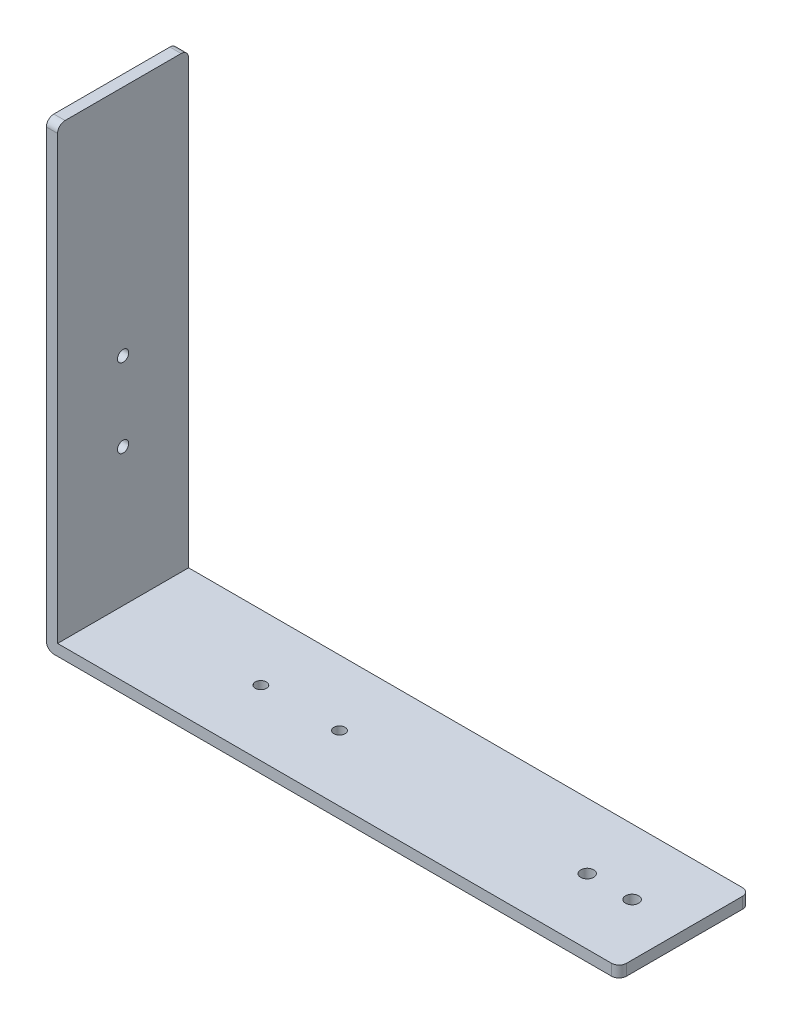
ISO-10303-21;
HEADER;
FILE_DESCRIPTION(('STEP AP214'),'2;1');
FILE_NAME('part.step','',(''),(''),'','','');
FILE_SCHEMA(('AUTOMOTIVE_DESIGN { 1 0 10303 214 1 1 1 1 }'));
ENDSEC;
DATA;
#1=APPLICATION_CONTEXT('core data for automotive mechanical design processes');
#2=APPLICATION_PROTOCOL_DEFINITION('international standard','automotive_design',2000,#1);
#3=PRODUCT_CONTEXT('',#1,'mechanical');
#4=PRODUCT('Part','Part','',(#3));
#5=PRODUCT_RELATED_PRODUCT_CATEGORY('part','',(#4));
#6=PRODUCT_DEFINITION_FORMATION('','',#4);
#7=PRODUCT_DEFINITION_CONTEXT('part definition',#1,'design');
#8=PRODUCT_DEFINITION('design','',#6,#7);
#9=PRODUCT_DEFINITION_SHAPE('','',#8);
#10=(LENGTH_UNIT() NAMED_UNIT(*) SI_UNIT(.MILLI.,.METRE.));
#11=(NAMED_UNIT(*) PLANE_ANGLE_UNIT() SI_UNIT($,.RADIAN.));
#12=(NAMED_UNIT(*) SI_UNIT($,.STERADIAN.) SOLID_ANGLE_UNIT());
#13=UNCERTAINTY_MEASURE_WITH_UNIT(LENGTH_MEASURE(1.E-05),#10,'distance_accuracy_value','');
#14=(GEOMETRIC_REPRESENTATION_CONTEXT(3) GLOBAL_UNCERTAINTY_ASSIGNED_CONTEXT((#13)) GLOBAL_UNIT_ASSIGNED_CONTEXT((#10,
#11,#12)) REPRESENTATION_CONTEXT('',''));
#15=CARTESIAN_POINT('',(0.,0.,0.));
#16=DIRECTION('',(0.,0.,1.));
#17=DIRECTION('',(1.,0.,0.));
#18=AXIS2_PLACEMENT_3D('',#15,#16,#17);
#19=CARTESIAN_POINT('',(0.,-3.,35.));
#20=DIRECTION('',(0.,1.,0.));
#21=DIRECTION('',(0.,0.,1.));
#22=AXIS2_PLACEMENT_3D('',#19,#20,#21);
#23=PLANE('',#22);
#24=CARTESIAN_POINT('',(57.8,-3.,17.5));
#25=DIRECTION('',(0.,1.,0.));
#26=DIRECTION('',(0.,0.,1.));
#27=AXIS2_PLACEMENT_3D('',#24,#25,#26);
#28=CIRCLE('',#27,1.5);
#29=CARTESIAN_POINT('',(57.8,-3.,19.));
#30=VERTEX_POINT('',#29);
#31=EDGE_CURVE('E212',#30,#30,#28,.T.);
#32=ORIENTED_EDGE('',*,*,#31,.T.);
#33=EDGE_LOOP('',(#32));
#34=FACE_BOUND('',#33,.T.);
#35=CARTESIAN_POINT('',(36.8,-3.,17.5));
#36=DIRECTION('',(0.,1.,0.));
#37=DIRECTION('',(0.,0.,1.));
#38=AXIS2_PLACEMENT_3D('',#35,#36,#37);
#39=CIRCLE('',#38,1.5);
#40=CARTESIAN_POINT('',(36.8,-3.,19.));
#41=VERTEX_POINT('',#40);
#42=EDGE_CURVE('E227',#41,#41,#39,.T.);
#43=ORIENTED_EDGE('',*,*,#42,.T.);
#44=EDGE_LOOP('',(#43));
#45=FACE_BOUND('',#44,.T.);
#46=CARTESIAN_POINT('',(136.,-3.,17.5));
#47=DIRECTION('',(0.,1.,0.));
#48=DIRECTION('',(0.,0.,1.));
#49=AXIS2_PLACEMENT_3D('',#46,#47,#48);
#50=CIRCLE('',#49,1.75000000000001);
#51=CARTESIAN_POINT('',(136.,-3.,19.25));
#52=VERTEX_POINT('',#51);
#53=EDGE_CURVE('E233',#52,#52,#50,.T.);
#54=ORIENTED_EDGE('',*,*,#53,.T.);
#55=EDGE_LOOP('',(#54));
#56=FACE_BOUND('',#55,.T.);
#57=CARTESIAN_POINT('',(124.,-3.,17.5));
#58=DIRECTION('',(0.,1.,0.));
#59=DIRECTION('',(0.,0.,1.));
#60=AXIS2_PLACEMENT_3D('',#57,#58,#59);
#61=CIRCLE('',#60,1.75000000000001);
#62=CARTESIAN_POINT('',(124.,-3.,19.25));
#63=VERTEX_POINT('',#62);
#64=EDGE_CURVE('E154',#63,#63,#61,.T.);
#65=ORIENTED_EDGE('',*,*,#64,.T.);
#66=EDGE_LOOP('',(#65));
#67=FACE_BOUND('',#66,.T.);
#68=DIRECTION('',(1.,0.,0.));
#69=VECTOR('',#68,1.);
#70=CARTESIAN_POINT('',(0.,-3.,35.));
#71=LINE('',#70,#69);
#72=CARTESIAN_POINT('',(-1.,-3.,35.));
#73=VERTEX_POINT('',#72);
#74=CARTESIAN_POINT('',(148.,-3.,35.));
#75=VERTEX_POINT('',#74);
#76=EDGE_CURVE('E143',#73,#75,#71,.T.);
#77=ORIENTED_EDGE('',*,*,#76,.F.);
#78=DIRECTION('',(0.,0.,-1.));
#79=VECTOR('',#78,1.);
#80=CARTESIAN_POINT('',(-1.,-3.,35.));
#81=LINE('',#80,#79);
#82=CARTESIAN_POINT('',(-1.,-3.,0.));
#83=VERTEX_POINT('',#82);
#84=EDGE_CURVE('E171',#73,#83,#81,.T.);
#85=ORIENTED_EDGE('',*,*,#84,.T.);
#86=DIRECTION('',(1.,0.,0.));
#87=VECTOR('',#86,1.);
#88=CARTESIAN_POINT('',(0.,-3.,0.));
#89=LINE('',#88,#87);
#90=CARTESIAN_POINT('',(148.,-3.,0.));
#91=VERTEX_POINT('',#90);
#92=EDGE_CURVE('E151',#83,#91,#89,.T.);
#93=ORIENTED_EDGE('',*,*,#92,.T.);
#94=CARTESIAN_POINT('',(148.,-3.,2.));
#95=DIRECTION('',(0.,1.,0.));
#96=DIRECTION('',(0.,0.,1.));
#97=AXIS2_PLACEMENT_3D('',#94,#95,#96);
#98=CIRCLE('',#97,2.);
#99=CARTESIAN_POINT('',(150.,-3.,2.));
#100=VERTEX_POINT('',#99);
#101=EDGE_CURVE('E167',#91,#100,#98,.F.);
#102=ORIENTED_EDGE('',*,*,#101,.T.);
#103=DIRECTION('',(0.,0.,-1.));
#104=VECTOR('',#103,1.);
#105=CARTESIAN_POINT('',(150.,-3.,35.));
#106=LINE('',#105,#104);
#107=CARTESIAN_POINT('',(150.,-3.,33.));
#108=VERTEX_POINT('',#107);
#109=EDGE_CURVE('E165',#108,#100,#106,.T.);
#110=ORIENTED_EDGE('',*,*,#109,.F.);
#111=CARTESIAN_POINT('',(148.,-3.,33.));
#112=DIRECTION('',(0.,1.,0.));
#113=DIRECTION('',(0.,0.,1.));
#114=AXIS2_PLACEMENT_3D('',#111,#112,#113);
#115=CIRCLE('',#114,2.);
#116=EDGE_CURVE('E169',#108,#75,#115,.F.);
#117=ORIENTED_EDGE('',*,*,#116,.T.);
#118=EDGE_LOOP('',(#77,#85,#93,#102,#110,#117));
#119=FACE_BOUND('',#118,.T.);
#120=ADVANCED_FACE('F33',(#34,#45,#56,#67,#119),#23,.F.);
#121=CARTESIAN_POINT('',(150.,0.,35.));
#122=DIRECTION('',(1.,0.,0.));
#123=DIRECTION('',(0.,0.,-1.));
#124=AXIS2_PLACEMENT_3D('',#121,#122,#123);
#125=PLANE('',#124);
#126=DIRECTION('',(0.,0.,-1.));
#127=VECTOR('',#126,1.);
#128=CARTESIAN_POINT('',(150.,0.,35.));
#129=LINE('',#128,#127);
#130=CARTESIAN_POINT('',(150.,0.,33.));
#131=VERTEX_POINT('',#130);
#132=CARTESIAN_POINT('',(150.,0.,2.));
#133=VERTEX_POINT('',#132);
#134=EDGE_CURVE('E135',#131,#133,#129,.T.);
#135=ORIENTED_EDGE('',*,*,#134,.F.);
#136=DIRECTION('',(0.,-1.,0.));
#137=VECTOR('',#136,1.);
#138=CARTESIAN_POINT('',(150.,-3.,33.));
#139=LINE('',#138,#137);
#140=EDGE_CURVE('E202',#131,#108,#139,.T.);
#141=ORIENTED_EDGE('',*,*,#140,.T.);
#142=ORIENTED_EDGE('',*,*,#109,.T.);
#143=DIRECTION('',(0.,-1.,0.));
#144=VECTOR('',#143,1.);
#145=CARTESIAN_POINT('',(150.,0.,2.));
#146=LINE('',#145,#144);
#147=EDGE_CURVE('E50',#100,#133,#146,.F.);
#148=ORIENTED_EDGE('',*,*,#147,.T.);
#149=EDGE_LOOP('',(#135,#141,#142,#148));
#150=FACE_BOUND('',#149,.T.);
#151=ADVANCED_FACE('F260',(#150),#125,.T.);
#152=CARTESIAN_POINT('',(0.,0.,35.));
#153=DIRECTION('',(0.,1.,0.));
#154=DIRECTION('',(0.,0.,1.));
#155=AXIS2_PLACEMENT_3D('',#152,#153,#154);
#156=PLANE('',#155);
#157=CARTESIAN_POINT('',(57.8,0.,17.5));
#158=DIRECTION('',(0.,1.,0.));
#159=DIRECTION('',(0.,0.,1.));
#160=AXIS2_PLACEMENT_3D('',#157,#158,#159);
#161=CIRCLE('',#160,1.5);
#162=CARTESIAN_POINT('',(57.8,0.,19.));
#163=VERTEX_POINT('',#162);
#164=EDGE_CURVE('E207',#163,#163,#161,.T.);
#165=ORIENTED_EDGE('',*,*,#164,.F.);
#166=EDGE_LOOP('',(#165));
#167=FACE_BOUND('',#166,.T.);
#168=CARTESIAN_POINT('',(36.8,0.,17.5));
#169=DIRECTION('',(0.,1.,0.));
#170=DIRECTION('',(0.,0.,1.));
#171=AXIS2_PLACEMENT_3D('',#168,#169,#170);
#172=CIRCLE('',#171,1.5);
#173=CARTESIAN_POINT('',(36.8,0.,19.));
#174=VERTEX_POINT('',#173);
#175=EDGE_CURVE('E224',#174,#174,#172,.T.);
#176=ORIENTED_EDGE('',*,*,#175,.F.);
#177=EDGE_LOOP('',(#176));
#178=FACE_BOUND('',#177,.T.);
#179=CARTESIAN_POINT('',(136.,0.,17.5));
#180=DIRECTION('',(0.,1.,0.));
#181=DIRECTION('',(0.,0.,1.));
#182=AXIS2_PLACEMENT_3D('',#179,#180,#181);
#183=CIRCLE('',#182,1.75000000000001);
#184=CARTESIAN_POINT('',(136.,0.,19.25));
#185=VERTEX_POINT('',#184);
#186=EDGE_CURVE('E230',#185,#185,#183,.T.);
#187=ORIENTED_EDGE('',*,*,#186,.F.);
#188=EDGE_LOOP('',(#187));
#189=FACE_BOUND('',#188,.T.);
#190=CARTESIAN_POINT('',(124.,0.,17.5));
#191=DIRECTION('',(0.,1.,0.));
#192=DIRECTION('',(0.,0.,1.));
#193=AXIS2_PLACEMENT_3D('',#190,#191,#192);
#194=CIRCLE('',#193,1.75000000000001);
#195=CARTESIAN_POINT('',(124.,0.,19.25));
#196=VERTEX_POINT('',#195);
#197=EDGE_CURVE('E236',#196,#196,#194,.T.);
#198=ORIENTED_EDGE('',*,*,#197,.F.);
#199=EDGE_LOOP('',(#198));
#200=FACE_BOUND('',#199,.T.);
#201=DIRECTION('',(1.,0.,0.));
#202=VECTOR('',#201,1.);
#203=CARTESIAN_POINT('',(0.,0.,35.));
#204=LINE('',#203,#202);
#205=CARTESIAN_POINT('',(0.,0.,35.));
#206=VERTEX_POINT('',#205);
#207=CARTESIAN_POINT('',(148.,0.,35.));
#208=VERTEX_POINT('',#207);
#209=EDGE_CURVE('E130',#206,#208,#204,.T.);
#210=ORIENTED_EDGE('',*,*,#209,.T.);
#211=CARTESIAN_POINT('',(148.,0.,33.));
#212=DIRECTION('',(0.,1.,0.));
#213=DIRECTION('',(0.,0.,1.));
#214=AXIS2_PLACEMENT_3D('',#211,#212,#213);
#215=CIRCLE('',#214,2.);
#216=EDGE_CURVE('E11',#208,#131,#215,.T.);
#217=ORIENTED_EDGE('',*,*,#216,.T.);
#218=ORIENTED_EDGE('',*,*,#134,.T.);
#219=CARTESIAN_POINT('',(148.,0.,2.));
#220=DIRECTION('',(0.,1.,0.));
#221=DIRECTION('',(0.,0.,1.));
#222=AXIS2_PLACEMENT_3D('',#219,#220,#221);
#223=CIRCLE('',#222,2.);
#224=CARTESIAN_POINT('',(148.,0.,0.));
#225=VERTEX_POINT('',#224);
#226=EDGE_CURVE('E42',#133,#225,#223,.T.);
#227=ORIENTED_EDGE('',*,*,#226,.T.);
#228=DIRECTION('',(1.,0.,0.));
#229=VECTOR('',#228,1.);
#230=CARTESIAN_POINT('',(0.,0.,0.));
#231=LINE('',#230,#229);
#232=CARTESIAN_POINT('',(0.,0.,0.));
#233=VERTEX_POINT('',#232);
#234=EDGE_CURVE('E134',#233,#225,#231,.T.);
#235=ORIENTED_EDGE('',*,*,#234,.F.);
#236=DIRECTION('',(0.,0.,-1.));
#237=VECTOR('',#236,1.);
#238=CARTESIAN_POINT('',(0.,0.,35.));
#239=LINE('',#238,#237);
#240=EDGE_CURVE('E123',#206,#233,#239,.T.);
#241=ORIENTED_EDGE('',*,*,#240,.F.);
#242=EDGE_LOOP('',(#210,#217,#218,#227,#235,#241));
#243=FACE_BOUND('',#242,.T.);
#244=ADVANCED_FACE('F132',(#167,#178,#189,#200,#243),#156,.T.);
#245=CARTESIAN_POINT('',(0.,0.,35.));
#246=DIRECTION('',(1.,0.,0.));
#247=DIRECTION('',(0.,0.,-1.));
#248=AXIS2_PLACEMENT_3D('',#245,#246,#247);
#249=PLANE('',#248);
#250=CARTESIAN_POINT('',(0.,57.8,17.5));
#251=DIRECTION('',(1.,0.,0.));
#252=DIRECTION('',(0.,0.,-1.));
#253=AXIS2_PLACEMENT_3D('',#250,#251,#252);
#254=CIRCLE('',#253,1.5);
#255=CARTESIAN_POINT('',(0.,57.8,16.));
#256=VERTEX_POINT('',#255);
#257=EDGE_CURVE('E219',#256,#256,#254,.T.);
#258=ORIENTED_EDGE('',*,*,#257,.F.);
#259=EDGE_LOOP('',(#258));
#260=FACE_BOUND('',#259,.T.);
#261=CARTESIAN_POINT('',(0.,36.8,17.5));
#262=DIRECTION('',(1.,0.,0.));
#263=DIRECTION('',(0.,0.,-1.));
#264=AXIS2_PLACEMENT_3D('',#261,#262,#263);
#265=CIRCLE('',#264,1.5);
#266=CARTESIAN_POINT('',(0.,36.8,16.));
#267=VERTEX_POINT('',#266);
#268=EDGE_CURVE('E208',#267,#267,#265,.T.);
#269=ORIENTED_EDGE('',*,*,#268,.F.);
#270=EDGE_LOOP('',(#269));
#271=FACE_BOUND('',#270,.T.);
#272=DIRECTION('',(0.,0.,-1.));
#273=VECTOR('',#272,1.);
#274=CARTESIAN_POINT('',(0.,120.,35.));
#275=LINE('',#274,#273);
#276=CARTESIAN_POINT('',(0.,120.,33.));
#277=VERTEX_POINT('',#276);
#278=CARTESIAN_POINT('',(0.,120.,2.));
#279=VERTEX_POINT('',#278);
#280=EDGE_CURVE('E136',#277,#279,#275,.T.);
#281=ORIENTED_EDGE('',*,*,#280,.F.);
#282=CARTESIAN_POINT('',(0.,118.,33.));
#283=DIRECTION('',(1.,0.,0.));
#284=DIRECTION('',(0.,0.,-1.));
#285=AXIS2_PLACEMENT_3D('',#282,#283,#284);
#286=CIRCLE('',#285,2.);
#287=CARTESIAN_POINT('',(0.,118.,35.));
#288=VERTEX_POINT('',#287);
#289=EDGE_CURVE('E125',#277,#288,#286,.T.);
#290=ORIENTED_EDGE('',*,*,#289,.T.);
#291=DIRECTION('',(0.,-1.,0.));
#292=VECTOR('',#291,1.);
#293=CARTESIAN_POINT('',(0.,0.,35.));
#294=LINE('',#293,#292);
#295=EDGE_CURVE('E118',#288,#206,#294,.T.);
#296=ORIENTED_EDGE('',*,*,#295,.T.);
#297=ORIENTED_EDGE('',*,*,#240,.T.);
#298=DIRECTION('',(0.,-1.,0.));
#299=VECTOR('',#298,1.);
#300=CARTESIAN_POINT('',(0.,0.,0.));
#301=LINE('',#300,#299);
#302=CARTESIAN_POINT('',(0.,118.,0.));
#303=VERTEX_POINT('',#302);
#304=EDGE_CURVE('E156',#303,#233,#301,.T.);
#305=ORIENTED_EDGE('',*,*,#304,.F.);
#306=CARTESIAN_POINT('',(0.,118.,2.));
#307=DIRECTION('',(1.,0.,0.));
#308=DIRECTION('',(0.,0.,-1.));
#309=AXIS2_PLACEMENT_3D('',#306,#307,#308);
#310=CIRCLE('',#309,2.);
#311=EDGE_CURVE('E198',#303,#279,#310,.T.);
#312=ORIENTED_EDGE('',*,*,#311,.T.);
#313=EDGE_LOOP('',(#281,#290,#296,#297,#305,#312));
#314=FACE_BOUND('',#313,.T.);
#315=ADVANCED_FACE('F121',(#260,#271,#314),#249,.T.);
#316=CARTESIAN_POINT('',(-3.,120.,35.));
#317=DIRECTION('',(0.,1.,0.));
#318=DIRECTION('',(0.,0.,1.));
#319=AXIS2_PLACEMENT_3D('',#316,#317,#318);
#320=PLANE('',#319);
#321=DIRECTION('',(0.,0.,-1.));
#322=VECTOR('',#321,1.);
#323=CARTESIAN_POINT('',(-3.,120.,35.));
#324=LINE('',#323,#322);
#325=CARTESIAN_POINT('',(-3.,120.,33.));
#326=VERTEX_POINT('',#325);
#327=CARTESIAN_POINT('',(-3.,120.,2.));
#328=VERTEX_POINT('',#327);
#329=EDGE_CURVE('E150',#326,#328,#324,.T.);
#330=ORIENTED_EDGE('',*,*,#329,.F.);
#331=DIRECTION('',(1.,0.,0.));
#332=VECTOR('',#331,1.);
#333=CARTESIAN_POINT('',(0.,120.,33.));
#334=LINE('',#333,#332);
#335=EDGE_CURVE('E195',#326,#277,#334,.T.);
#336=ORIENTED_EDGE('',*,*,#335,.T.);
#337=ORIENTED_EDGE('',*,*,#280,.T.);
#338=DIRECTION('',(1.,0.,0.));
#339=VECTOR('',#338,1.);
#340=CARTESIAN_POINT('',(-3.,120.,2.));
#341=LINE('',#340,#339);
#342=EDGE_CURVE('E193',#279,#328,#341,.F.);
#343=ORIENTED_EDGE('',*,*,#342,.T.);
#344=EDGE_LOOP('',(#330,#336,#337,#343));
#345=FACE_BOUND('',#344,.T.);
#346=ADVANCED_FACE('F299',(#345),#320,.T.);
#347=CARTESIAN_POINT('',(-3.,0.,35.));
#348=DIRECTION('',(1.,0.,0.));
#349=DIRECTION('',(0.,0.,-1.));
#350=AXIS2_PLACEMENT_3D('',#347,#348,#349);
#351=PLANE('',#350);
#352=CARTESIAN_POINT('',(-3.,57.8,17.5));
#353=DIRECTION('',(1.,0.,0.));
#354=DIRECTION('',(0.,0.,-1.));
#355=AXIS2_PLACEMENT_3D('',#352,#353,#354);
#356=CIRCLE('',#355,1.5);
#357=CARTESIAN_POINT('',(-3.,57.8,16.));
#358=VERTEX_POINT('',#357);
#359=EDGE_CURVE('E37',#358,#358,#356,.T.);
#360=ORIENTED_EDGE('',*,*,#359,.T.);
#361=EDGE_LOOP('',(#360));
#362=FACE_BOUND('',#361,.T.);
#363=CARTESIAN_POINT('',(-3.,36.8,17.5));
#364=DIRECTION('',(1.,0.,0.));
#365=DIRECTION('',(0.,0.,-1.));
#366=AXIS2_PLACEMENT_3D('',#363,#364,#365);
#367=CIRCLE('',#366,1.5);
#368=CARTESIAN_POINT('',(-3.,36.8,16.));
#369=VERTEX_POINT('',#368);
#370=EDGE_CURVE('E205',#369,#369,#367,.T.);
#371=ORIENTED_EDGE('',*,*,#370,.T.);
#372=EDGE_LOOP('',(#371));
#373=FACE_BOUND('',#372,.T.);
#374=DIRECTION('',(0.,1.,0.));
#375=VECTOR('',#374,1.);
#376=CARTESIAN_POINT('',(-3.,0.,0.));
#377=LINE('',#376,#375);
#378=CARTESIAN_POINT('',(-3.,118.,0.));
#379=VERTEX_POINT('',#378);
#380=CARTESIAN_POINT('',(-3.,-1.,0.));
#381=VERTEX_POINT('',#380);
#382=EDGE_CURVE('E145',#379,#381,#377,.F.);
#383=ORIENTED_EDGE('',*,*,#382,.T.);
#384=DIRECTION('',(0.,0.,-1.));
#385=VECTOR('',#384,1.);
#386=CARTESIAN_POINT('',(-3.,-1.,35.));
#387=LINE('',#386,#385);
#388=CARTESIAN_POINT('',(-3.,-1.,35.));
#389=VERTEX_POINT('',#388);
#390=EDGE_CURVE('E186',#381,#389,#387,.F.);
#391=ORIENTED_EDGE('',*,*,#390,.T.);
#392=DIRECTION('',(0.,1.,0.));
#393=VECTOR('',#392,1.);
#394=CARTESIAN_POINT('',(-3.,0.,35.));
#395=LINE('',#394,#393);
#396=CARTESIAN_POINT('',(-3.,118.,35.));
#397=VERTEX_POINT('',#396);
#398=EDGE_CURVE('E129',#397,#389,#395,.F.);
#399=ORIENTED_EDGE('',*,*,#398,.F.);
#400=CARTESIAN_POINT('',(-3.,118.,33.));
#401=DIRECTION('',(1.,0.,0.));
#402=DIRECTION('',(0.,0.,-1.));
#403=AXIS2_PLACEMENT_3D('',#400,#401,#402);
#404=CIRCLE('',#403,2.);
#405=EDGE_CURVE('E184',#397,#326,#404,.F.);
#406=ORIENTED_EDGE('',*,*,#405,.T.);
#407=ORIENTED_EDGE('',*,*,#329,.T.);
#408=CARTESIAN_POINT('',(-3.,118.,2.));
#409=DIRECTION('',(1.,0.,0.));
#410=DIRECTION('',(0.,0.,-1.));
#411=AXIS2_PLACEMENT_3D('',#408,#409,#410);
#412=CIRCLE('',#411,2.);
#413=EDGE_CURVE('E182',#328,#379,#412,.F.);
#414=ORIENTED_EDGE('',*,*,#413,.T.);
#415=EDGE_LOOP('',(#383,#391,#399,#406,#407,#414));
#416=FACE_BOUND('',#415,.T.);
#417=ADVANCED_FACE('F303',(#362,#373,#416),#351,.F.);
#418=CARTESIAN_POINT('',(0.,0.,35.));
#419=DIRECTION('',(0.,0.,-1.));
#420=DIRECTION('',(-1.,0.,0.));
#421=AXIS2_PLACEMENT_3D('',#418,#419,#420);
#422=PLANE('',#421);
#423=ORIENTED_EDGE('',*,*,#398,.T.);
#424=CARTESIAN_POINT('',(-1.,-1.,35.));
#425=DIRECTION('',(0.,0.,-1.));
#426=DIRECTION('',(-1.,0.,0.));
#427=AXIS2_PLACEMENT_3D('',#424,#425,#426);
#428=CIRCLE('',#427,2.);
#429=EDGE_CURVE('E191',#389,#73,#428,.F.);
#430=ORIENTED_EDGE('',*,*,#429,.T.);
#431=ORIENTED_EDGE('',*,*,#76,.T.);
#432=DIRECTION('',(0.,-1.,0.));
#433=VECTOR('',#432,1.);
#434=CARTESIAN_POINT('',(148.,0.,35.));
#435=LINE('',#434,#433);
#436=EDGE_CURVE('E142',#75,#208,#435,.F.);
#437=ORIENTED_EDGE('',*,*,#436,.T.);
#438=ORIENTED_EDGE('',*,*,#209,.F.);
#439=ORIENTED_EDGE('',*,*,#295,.F.);
#440=DIRECTION('',(1.,0.,0.));
#441=VECTOR('',#440,1.);
#442=CARTESIAN_POINT('',(-3.,118.,35.));
#443=LINE('',#442,#441);
#444=EDGE_CURVE('E189',#288,#397,#443,.F.);
#445=ORIENTED_EDGE('',*,*,#444,.T.);
#446=EDGE_LOOP('',(#423,#430,#431,#437,#438,#439,#445));
#447=FACE_BOUND('',#446,.T.);
#448=ADVANCED_FACE('F139',(#447),#422,.F.);
#449=CARTESIAN_POINT('',(0.,0.,0.));
#450=DIRECTION('',(0.,0.,-1.));
#451=DIRECTION('',(-1.,0.,0.));
#452=AXIS2_PLACEMENT_3D('',#449,#450,#451);
#453=PLANE('',#452);
#454=ORIENTED_EDGE('',*,*,#92,.F.);
#455=CARTESIAN_POINT('',(-1.,-1.,0.));
#456=DIRECTION('',(0.,0.,-1.));
#457=DIRECTION('',(-1.,0.,0.));
#458=AXIS2_PLACEMENT_3D('',#455,#456,#457);
#459=CIRCLE('',#458,2.);
#460=EDGE_CURVE('E180',#83,#381,#459,.T.);
#461=ORIENTED_EDGE('',*,*,#460,.T.);
#462=ORIENTED_EDGE('',*,*,#382,.F.);
#463=DIRECTION('',(1.,0.,0.));
#464=VECTOR('',#463,1.);
#465=CARTESIAN_POINT('',(0.,118.,0.));
#466=LINE('',#465,#464);
#467=EDGE_CURVE('E177',#379,#303,#466,.T.);
#468=ORIENTED_EDGE('',*,*,#467,.T.);
#469=ORIENTED_EDGE('',*,*,#304,.T.);
#470=ORIENTED_EDGE('',*,*,#234,.T.);
#471=DIRECTION('',(0.,-1.,0.));
#472=VECTOR('',#471,1.);
#473=CARTESIAN_POINT('',(148.,0.,0.));
#474=LINE('',#473,#472);
#475=EDGE_CURVE('E174',#225,#91,#474,.T.);
#476=ORIENTED_EDGE('',*,*,#475,.T.);
#477=EDGE_LOOP('',(#454,#461,#462,#468,#469,#470,#476));
#478=FACE_BOUND('',#477,.T.);
#479=ADVANCED_FACE('F246',(#478),#453,.T.);
#480=CARTESIAN_POINT('',(124.,-10.,17.5));
#481=DIRECTION('',(0.,1.,0.));
#482=DIRECTION('',(0.,0.,1.));
#483=AXIS2_PLACEMENT_3D('',#480,#481,#482);
#484=CYLINDRICAL_SURFACE('',#483,1.75000000000001);
#485=ORIENTED_EDGE('',*,*,#197,.T.);
#486=EDGE_LOOP('',(#485));
#487=FACE_BOUND('',#486,.T.);
#488=ORIENTED_EDGE('',*,*,#64,.F.);
#489=EDGE_LOOP('',(#488));
#490=FACE_BOUND('',#489,.T.);
#491=ADVANCED_FACE('F243',(#487,#490),#484,.F.);
#492=CARTESIAN_POINT('',(136.,-10.,17.5));
#493=DIRECTION('',(0.,1.,0.));
#494=DIRECTION('',(0.,0.,1.));
#495=AXIS2_PLACEMENT_3D('',#492,#493,#494);
#496=CYLINDRICAL_SURFACE('',#495,1.75000000000001);
#497=ORIENTED_EDGE('',*,*,#186,.T.);
#498=EDGE_LOOP('',(#497));
#499=FACE_BOUND('',#498,.T.);
#500=ORIENTED_EDGE('',*,*,#53,.F.);
#501=EDGE_LOOP('',(#500));
#502=FACE_BOUND('',#501,.T.);
#503=ADVANCED_FACE('F245',(#499,#502),#496,.F.);
#504=CARTESIAN_POINT('',(-1.,-1.,35.));
#505=DIRECTION('',(0.,0.,-1.));
#506=DIRECTION('',(-1.,0.,0.));
#507=AXIS2_PLACEMENT_3D('',#504,#505,#506);
#508=CYLINDRICAL_SURFACE('',#507,2.);
#509=ORIENTED_EDGE('',*,*,#429,.F.);
#510=ORIENTED_EDGE('',*,*,#390,.F.);
#511=ORIENTED_EDGE('',*,*,#460,.F.);
#512=ORIENTED_EDGE('',*,*,#84,.F.);
#513=EDGE_LOOP('',(#509,#510,#511,#512));
#514=FACE_BOUND('',#513,.T.);
#515=ADVANCED_FACE('F253',(#514),#508,.T.);
#516=CARTESIAN_POINT('',(-3.,118.,33.));
#517=DIRECTION('',(-1.,0.,0.));
#518=DIRECTION('',(0.,0.,1.));
#519=AXIS2_PLACEMENT_3D('',#516,#517,#518);
#520=CYLINDRICAL_SURFACE('',#519,2.);
#521=ORIENTED_EDGE('',*,*,#405,.F.);
#522=ORIENTED_EDGE('',*,*,#444,.F.);
#523=ORIENTED_EDGE('',*,*,#289,.F.);
#524=ORIENTED_EDGE('',*,*,#335,.F.);
#525=EDGE_LOOP('',(#521,#522,#523,#524));
#526=FACE_BOUND('',#525,.T.);
#527=ADVANCED_FACE('F272',(#526),#520,.T.);
#528=CARTESIAN_POINT('',(0.,118.,2.));
#529=DIRECTION('',(1.,0.,0.));
#530=DIRECTION('',(0.,0.,-1.));
#531=AXIS2_PLACEMENT_3D('',#528,#529,#530);
#532=CYLINDRICAL_SURFACE('',#531,2.);
#533=ORIENTED_EDGE('',*,*,#413,.F.);
#534=ORIENTED_EDGE('',*,*,#342,.F.);
#535=ORIENTED_EDGE('',*,*,#311,.F.);
#536=ORIENTED_EDGE('',*,*,#467,.F.);
#537=EDGE_LOOP('',(#533,#534,#535,#536));
#538=FACE_BOUND('',#537,.T.);
#539=ADVANCED_FACE('F276',(#538),#532,.T.);
#540=CARTESIAN_POINT('',(148.,0.,33.));
#541=DIRECTION('',(0.,1.,0.));
#542=DIRECTION('',(0.,0.,1.));
#543=AXIS2_PLACEMENT_3D('',#540,#541,#542);
#544=CYLINDRICAL_SURFACE('',#543,2.);
#545=ORIENTED_EDGE('',*,*,#216,.F.);
#546=ORIENTED_EDGE('',*,*,#436,.F.);
#547=ORIENTED_EDGE('',*,*,#116,.F.);
#548=ORIENTED_EDGE('',*,*,#140,.F.);
#549=EDGE_LOOP('',(#545,#546,#547,#548));
#550=FACE_BOUND('',#549,.T.);
#551=ADVANCED_FACE('F279',(#550),#544,.T.);
#552=CARTESIAN_POINT('',(148.,0.,2.));
#553=DIRECTION('',(0.,-1.,0.));
#554=DIRECTION('',(0.,0.,-1.));
#555=AXIS2_PLACEMENT_3D('',#552,#553,#554);
#556=CYLINDRICAL_SURFACE('',#555,2.);
#557=ORIENTED_EDGE('',*,*,#226,.F.);
#558=ORIENTED_EDGE('',*,*,#147,.F.);
#559=ORIENTED_EDGE('',*,*,#101,.F.);
#560=ORIENTED_EDGE('',*,*,#475,.F.);
#561=EDGE_LOOP('',(#557,#558,#559,#560));
#562=FACE_BOUND('',#561,.T.);
#563=ADVANCED_FACE('F35',(#562),#556,.T.);
#564=CARTESIAN_POINT('',(36.8,-10.,17.5));
#565=DIRECTION('',(0.,1.,0.));
#566=DIRECTION('',(0.,0.,1.));
#567=AXIS2_PLACEMENT_3D('',#564,#565,#566);
#568=CYLINDRICAL_SURFACE('',#567,1.5);
#569=ORIENTED_EDGE('',*,*,#175,.T.);
#570=EDGE_LOOP('',(#569));
#571=FACE_BOUND('',#570,.T.);
#572=ORIENTED_EDGE('',*,*,#42,.F.);
#573=EDGE_LOOP('',(#572));
#574=FACE_BOUND('',#573,.T.);
#575=ADVANCED_FACE('F286',(#571,#574),#568,.F.);
#576=CARTESIAN_POINT('',(57.8,-10.,17.5));
#577=DIRECTION('',(0.,1.,0.));
#578=DIRECTION('',(0.,0.,1.));
#579=AXIS2_PLACEMENT_3D('',#576,#577,#578);
#580=CYLINDRICAL_SURFACE('',#579,1.5);
#581=ORIENTED_EDGE('',*,*,#164,.T.);
#582=EDGE_LOOP('',(#581));
#583=FACE_BOUND('',#582,.T.);
#584=ORIENTED_EDGE('',*,*,#31,.F.);
#585=EDGE_LOOP('',(#584));
#586=FACE_BOUND('',#585,.T.);
#587=ADVANCED_FACE('F337',(#583,#586),#580,.F.);
#588=CARTESIAN_POINT('',(-10.,36.8,17.5));
#589=DIRECTION('',(1.,0.,0.));
#590=DIRECTION('',(0.,0.,-1.));
#591=AXIS2_PLACEMENT_3D('',#588,#589,#590);
#592=CYLINDRICAL_SURFACE('',#591,1.5);
#593=ORIENTED_EDGE('',*,*,#268,.T.);
#594=EDGE_LOOP('',(#593));
#595=FACE_BOUND('',#594,.T.);
#596=ORIENTED_EDGE('',*,*,#370,.F.);
#597=EDGE_LOOP('',(#596));
#598=FACE_BOUND('',#597,.T.);
#599=ADVANCED_FACE('F343',(#595,#598),#592,.F.);
#600=CARTESIAN_POINT('',(-10.,57.8,17.5));
#601=DIRECTION('',(1.,0.,0.));
#602=DIRECTION('',(0.,0.,-1.));
#603=AXIS2_PLACEMENT_3D('',#600,#601,#602);
#604=CYLINDRICAL_SURFACE('',#603,1.5);
#605=ORIENTED_EDGE('',*,*,#257,.T.);
#606=EDGE_LOOP('',(#605));
#607=FACE_BOUND('',#606,.T.);
#608=ORIENTED_EDGE('',*,*,#359,.F.);
#609=EDGE_LOOP('',(#608));
#610=FACE_BOUND('',#609,.T.);
#611=ADVANCED_FACE('F349',(#607,#610),#604,.F.);
#612=CLOSED_SHELL('',(#120,#151,#244,#315,#346,#417,#448,#479,#491,#503,#515,#527,#539,#551,
#563,#575,#587,#599,#611));
#613=MANIFOLD_SOLID_BREP('B2',#612);
#614=ADVANCED_BREP_SHAPE_REPRESENTATION('',(#18,#613),#14);
#615=SHAPE_DEFINITION_REPRESENTATION(#9,#614);
ENDSEC;
END-ISO-10303-21;
